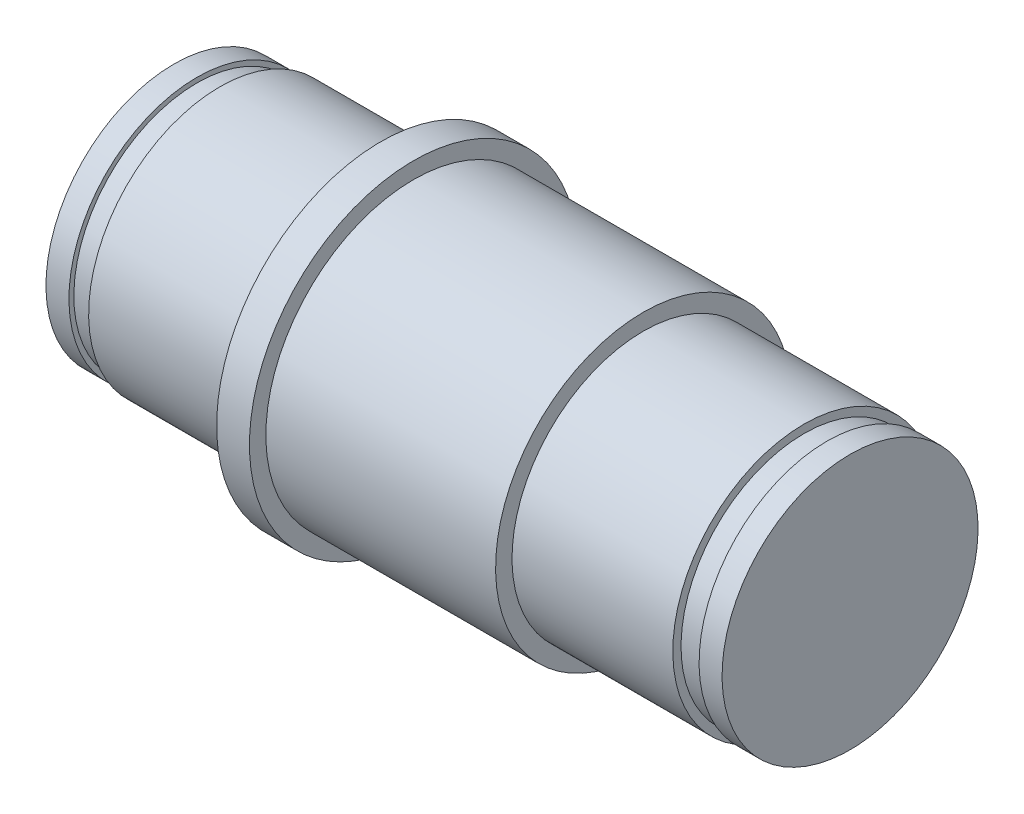
ISO-10303-21;
HEADER;
FILE_DESCRIPTION(('STEP AP214'),'2;1');
FILE_NAME('part.step','',(''),(''),'','','');
FILE_SCHEMA(('AUTOMOTIVE_DESIGN { 1 0 10303 214 1 1 1 1 }'));
ENDSEC;
DATA;
#1=APPLICATION_CONTEXT('core data for automotive mechanical design processes');
#2=APPLICATION_PROTOCOL_DEFINITION('international standard','automotive_design',2000,#1);
#3=PRODUCT_CONTEXT('',#1,'mechanical');
#4=PRODUCT('Part','Part','',(#3));
#5=PRODUCT_RELATED_PRODUCT_CATEGORY('part','',(#4));
#6=PRODUCT_DEFINITION_FORMATION('','',#4);
#7=PRODUCT_DEFINITION_CONTEXT('part definition',#1,'design');
#8=PRODUCT_DEFINITION('design','',#6,#7);
#9=PRODUCT_DEFINITION_SHAPE('','',#8);
#10=(LENGTH_UNIT() NAMED_UNIT(*) SI_UNIT(.MILLI.,.METRE.));
#11=(NAMED_UNIT(*) PLANE_ANGLE_UNIT() SI_UNIT($,.RADIAN.));
#12=(NAMED_UNIT(*) SI_UNIT($,.STERADIAN.) SOLID_ANGLE_UNIT());
#13=UNCERTAINTY_MEASURE_WITH_UNIT(LENGTH_MEASURE(1.E-05),#10,'distance_accuracy_value','');
#14=(GEOMETRIC_REPRESENTATION_CONTEXT(3) GLOBAL_UNCERTAINTY_ASSIGNED_CONTEXT((#13)) GLOBAL_UNIT_ASSIGNED_CONTEXT((#10,
#11,#12)) REPRESENTATION_CONTEXT('',''));
#15=CARTESIAN_POINT('',(0.,0.,0.));
#16=DIRECTION('',(0.,0.,1.));
#17=DIRECTION('',(1.,0.,0.));
#18=AXIS2_PLACEMENT_3D('',#15,#16,#17);
#19=CARTESIAN_POINT('',(10.3,3.90000000000001,0.));
#20=DIRECTION('',(1.,0.,0.));
#21=DIRECTION('',(0.,1.,0.));
#22=AXIS2_PLACEMENT_3D('',#19,#20,#21);
#23=PLANE('',#22);
#24=CARTESIAN_POINT('',(10.3,0.,0.));
#25=DIRECTION('',(1.,0.,0.));
#26=DIRECTION('',(0.,1.,0.));
#27=AXIS2_PLACEMENT_3D('',#24,#25,#26);
#28=CIRCLE('',#27,3.90000000000001);
#29=CARTESIAN_POINT('',(10.3,3.90000000000001,0.));
#30=VERTEX_POINT('',#29);
#31=EDGE_CURVE('E83',#30,#30,#28,.T.);
#32=ORIENTED_EDGE('',*,*,#31,.T.);
#33=EDGE_LOOP('',(#32));
#34=FACE_BOUND('',#33,.T.);
#35=ADVANCED_FACE('F37',(#34),#23,.T.);
#36=CARTESIAN_POINT('',(15.6918050758463,0.,0.));
#37=DIRECTION('',(1.,0.,0.));
#38=DIRECTION('',(0.,1.,0.));
#39=AXIS2_PLACEMENT_3D('',#36,#37,#38);
#40=CYLINDRICAL_SURFACE('',#39,4.50000000000042);
#41=CARTESIAN_POINT('',(-3.,0.,0.));
#42=DIRECTION('',(1.,0.,0.));
#43=DIRECTION('',(0.,0.,-1.));
#44=AXIS2_PLACEMENT_3D('',#41,#42,#43);
#45=CIRCLE('',#44,4.50000000000042);
#46=CARTESIAN_POINT('',(-3.,0.,-4.50000000000042));
#47=VERTEX_POINT('',#46);
#48=EDGE_CURVE('E10',#47,#47,#45,.F.);
#49=ORIENTED_EDGE('',*,*,#48,.F.);
#50=EDGE_LOOP('',(#49));
#51=FACE_BOUND('',#50,.T.);
#52=CARTESIAN_POINT('',(4.,0.,0.));
#53=DIRECTION('',(1.,0.,0.));
#54=DIRECTION('',(0.,1.,0.));
#55=AXIS2_PLACEMENT_3D('',#52,#53,#54);
#56=CIRCLE('',#55,4.50000000000042);
#57=CARTESIAN_POINT('',(4.,4.50000000000042,0.));
#58=VERTEX_POINT('',#57);
#59=EDGE_CURVE('E65',#58,#58,#56,.T.);
#60=ORIENTED_EDGE('',*,*,#59,.F.);
#61=EDGE_LOOP('',(#60));
#62=FACE_BOUND('',#61,.T.);
#63=ADVANCED_FACE('F110',(#51,#62),#40,.T.);
#64=CARTESIAN_POINT('',(4.,4.50000000000042,0.));
#65=DIRECTION('',(1.,0.,0.));
#66=DIRECTION('',(0.,1.,0.));
#67=AXIS2_PLACEMENT_3D('',#64,#65,#66);
#68=PLANE('',#67);
#69=ORIENTED_EDGE('',*,*,#59,.T.);
#70=EDGE_LOOP('',(#69));
#71=FACE_BOUND('',#70,.T.);
#72=CARTESIAN_POINT('',(4.,0.,0.));
#73=DIRECTION('',(1.,0.,0.));
#74=DIRECTION('',(0.,1.,0.));
#75=AXIS2_PLACEMENT_3D('',#72,#73,#74);
#76=CIRCLE('',#75,4.);
#77=CARTESIAN_POINT('',(4.,4.,0.));
#78=VERTEX_POINT('',#77);
#79=EDGE_CURVE('E68',#78,#78,#76,.T.);
#80=ORIENTED_EDGE('',*,*,#79,.F.);
#81=EDGE_LOOP('',(#80));
#82=FACE_BOUND('',#81,.T.);
#83=ADVANCED_FACE('F115',(#71,#82),#68,.T.);
#84=CARTESIAN_POINT('',(15.6918050758463,0.,0.));
#85=DIRECTION('',(1.,0.,0.));
#86=DIRECTION('',(0.,1.,0.));
#87=AXIS2_PLACEMENT_3D('',#84,#85,#86);
#88=CYLINDRICAL_SURFACE('',#87,4.);
#89=ORIENTED_EDGE('',*,*,#79,.T.);
#90=EDGE_LOOP('',(#89));
#91=FACE_BOUND('',#90,.T.);
#92=CARTESIAN_POINT('',(8.89999999999999,0.,0.));
#93=DIRECTION('',(1.,0.,0.));
#94=DIRECTION('',(0.,1.,0.));
#95=AXIS2_PLACEMENT_3D('',#92,#93,#94);
#96=CIRCLE('',#95,4.);
#97=CARTESIAN_POINT('',(8.89999999999999,4.,0.));
#98=VERTEX_POINT('',#97);
#99=EDGE_CURVE('E71',#98,#98,#96,.T.);
#100=ORIENTED_EDGE('',*,*,#99,.F.);
#101=EDGE_LOOP('',(#100));
#102=FACE_BOUND('',#101,.T.);
#103=ADVANCED_FACE('F123',(#91,#102),#88,.T.);
#104=CARTESIAN_POINT('',(8.89999999999999,4.,0.));
#105=DIRECTION('',(1.,0.,0.));
#106=DIRECTION('',(0.,1.,0.));
#107=AXIS2_PLACEMENT_3D('',#104,#105,#106);
#108=PLANE('',#107);
#109=ORIENTED_EDGE('',*,*,#99,.T.);
#110=EDGE_LOOP('',(#109));
#111=FACE_BOUND('',#110,.T.);
#112=CARTESIAN_POINT('',(8.89999999999999,0.,0.));
#113=DIRECTION('',(1.,0.,0.));
#114=DIRECTION('',(0.,1.,0.));
#115=AXIS2_PLACEMENT_3D('',#112,#113,#114);
#116=CIRCLE('',#115,3.75);
#117=CARTESIAN_POINT('',(8.89999999999999,3.75,0.));
#118=VERTEX_POINT('',#117);
#119=EDGE_CURVE('E74',#118,#118,#116,.T.);
#120=ORIENTED_EDGE('',*,*,#119,.F.);
#121=EDGE_LOOP('',(#120));
#122=FACE_BOUND('',#121,.T.);
#123=ADVANCED_FACE('F226',(#111,#122),#108,.T.);
#124=CARTESIAN_POINT('',(15.6918050758463,0.,0.));
#125=DIRECTION('',(1.,0.,0.));
#126=DIRECTION('',(0.,1.,0.));
#127=AXIS2_PLACEMENT_3D('',#124,#125,#126);
#128=CYLINDRICAL_SURFACE('',#127,3.75);
#129=ORIENTED_EDGE('',*,*,#119,.T.);
#130=EDGE_LOOP('',(#129));
#131=FACE_BOUND('',#130,.T.);
#132=CARTESIAN_POINT('',(9.6,0.,0.));
#133=DIRECTION('',(1.,0.,0.));
#134=DIRECTION('',(0.,1.,0.));
#135=AXIS2_PLACEMENT_3D('',#132,#133,#134);
#136=CIRCLE('',#135,3.75);
#137=CARTESIAN_POINT('',(9.6,3.75,0.));
#138=VERTEX_POINT('',#137);
#139=EDGE_CURVE('E77',#138,#138,#136,.T.);
#140=ORIENTED_EDGE('',*,*,#139,.F.);
#141=EDGE_LOOP('',(#140));
#142=FACE_BOUND('',#141,.T.);
#143=ADVANCED_FACE('F215',(#131,#142),#128,.T.);
#144=CARTESIAN_POINT('',(9.6,3.75,0.));
#145=DIRECTION('',(-1.,0.,0.));
#146=DIRECTION('',(0.,-1.,0.));
#147=AXIS2_PLACEMENT_3D('',#144,#145,#146);
#148=PLANE('',#147);
#149=ORIENTED_EDGE('',*,*,#139,.T.);
#150=EDGE_LOOP('',(#149));
#151=FACE_BOUND('',#150,.T.);
#152=CARTESIAN_POINT('',(9.6,0.,0.));
#153=DIRECTION('',(1.,0.,0.));
#154=DIRECTION('',(0.,1.,0.));
#155=AXIS2_PLACEMENT_3D('',#152,#153,#154);
#156=CIRCLE('',#155,3.90000000000001);
#157=CARTESIAN_POINT('',(9.6,3.90000000000001,0.));
#158=VERTEX_POINT('',#157);
#159=EDGE_CURVE('E80',#158,#158,#156,.T.);
#160=ORIENTED_EDGE('',*,*,#159,.F.);
#161=EDGE_LOOP('',(#160));
#162=FACE_BOUND('',#161,.T.);
#163=ADVANCED_FACE('F106',(#151,#162),#148,.T.);
#164=CARTESIAN_POINT('',(15.6918050758463,0.,0.));
#165=DIRECTION('',(1.,0.,0.));
#166=DIRECTION('',(0.,1.,0.));
#167=AXIS2_PLACEMENT_3D('',#164,#165,#166);
#168=CYLINDRICAL_SURFACE('',#167,3.90000000000001);
#169=ORIENTED_EDGE('',*,*,#159,.T.);
#170=EDGE_LOOP('',(#169));
#171=FACE_BOUND('',#170,.T.);
#172=ORIENTED_EDGE('',*,*,#31,.F.);
#173=EDGE_LOOP('',(#172));
#174=FACE_BOUND('',#173,.T.);
#175=ADVANCED_FACE('F97',(#171,#174),#168,.T.);
#176=CARTESIAN_POINT('',(0.,0.,0.));
#177=DIRECTION('',(1.,0.,0.));
#178=DIRECTION('',(0.,0.,-1.));
#179=AXIS2_PLACEMENT_3D('',#176,#177,#178);
#180=CYLINDRICAL_SURFACE('',#179,5.00000000000042);
#181=CARTESIAN_POINT('',(-4.,0.,0.));
#182=DIRECTION('',(1.,0.,0.));
#183=DIRECTION('',(0.,0.,-1.));
#184=AXIS2_PLACEMENT_3D('',#181,#182,#183);
#185=CIRCLE('',#184,5.00000000000042);
#186=CARTESIAN_POINT('',(-4.,0.,-5.00000000000042));
#187=VERTEX_POINT('',#186);
#188=EDGE_CURVE('E86',#187,#187,#185,.T.);
#189=ORIENTED_EDGE('',*,*,#188,.T.);
#190=EDGE_LOOP('',(#189));
#191=FACE_BOUND('',#190,.T.);
#192=CARTESIAN_POINT('',(-3.,0.,0.));
#193=DIRECTION('',(1.,0.,0.));
#194=DIRECTION('',(0.,0.,-1.));
#195=AXIS2_PLACEMENT_3D('',#192,#193,#194);
#196=CIRCLE('',#195,5.00000000000042);
#197=CARTESIAN_POINT('',(-3.,0.,-5.00000000000042));
#198=VERTEX_POINT('',#197);
#199=EDGE_CURVE('E89',#198,#198,#196,.T.);
#200=ORIENTED_EDGE('',*,*,#199,.F.);
#201=EDGE_LOOP('',(#200));
#202=FACE_BOUND('',#201,.T.);
#203=ADVANCED_FACE('F95',(#191,#202),#180,.T.);
#204=CARTESIAN_POINT('',(-3.,4.50000000000042,0.));
#205=DIRECTION('',(1.,0.,0.));
#206=DIRECTION('',(0.,0.,-1.));
#207=AXIS2_PLACEMENT_3D('',#204,#205,#206);
#208=PLANE('',#207);
#209=ORIENTED_EDGE('',*,*,#199,.T.);
#210=EDGE_LOOP('',(#209));
#211=FACE_BOUND('',#210,.T.);
#212=ORIENTED_EDGE('',*,*,#48,.T.);
#213=EDGE_LOOP('',(#212));
#214=FACE_BOUND('',#213,.T.);
#215=ADVANCED_FACE('F93',(#211,#214),#208,.T.);
#216=CARTESIAN_POINT('',(-10.3,0.,0.));
#217=DIRECTION('',(-1.,0.,0.));
#218=DIRECTION('',(0.,-1.,0.));
#219=AXIS2_PLACEMENT_3D('',#216,#217,#218);
#220=PLANE('',#219);
#221=CARTESIAN_POINT('',(-10.3,0.,0.));
#222=DIRECTION('',(1.,0.,0.));
#223=DIRECTION('',(0.,1.,0.));
#224=AXIS2_PLACEMENT_3D('',#221,#222,#223);
#225=CIRCLE('',#224,3.89999999999999);
#226=CARTESIAN_POINT('',(-10.3,3.89999999999999,0.));
#227=VERTEX_POINT('',#226);
#228=EDGE_CURVE('E43',#227,#227,#225,.T.);
#229=ORIENTED_EDGE('',*,*,#228,.F.);
#230=EDGE_LOOP('',(#229));
#231=FACE_BOUND('',#230,.T.);
#232=ADVANCED_FACE('F104',(#231),#220,.T.);
#233=CARTESIAN_POINT('',(15.6918050758463,0.,0.));
#234=DIRECTION('',(1.,0.,0.));
#235=DIRECTION('',(0.,1.,0.));
#236=AXIS2_PLACEMENT_3D('',#233,#234,#235);
#237=CYLINDRICAL_SURFACE('',#236,3.89999999999999);
#238=ORIENTED_EDGE('',*,*,#228,.T.);
#239=EDGE_LOOP('',(#238));
#240=FACE_BOUND('',#239,.T.);
#241=CARTESIAN_POINT('',(-9.6,0.,0.));
#242=DIRECTION('',(1.,0.,0.));
#243=DIRECTION('',(0.,1.,0.));
#244=AXIS2_PLACEMENT_3D('',#241,#242,#243);
#245=CIRCLE('',#244,3.89999999999999);
#246=CARTESIAN_POINT('',(-9.6,3.89999999999999,0.));
#247=VERTEX_POINT('',#246);
#248=EDGE_CURVE('E47',#247,#247,#245,.T.);
#249=ORIENTED_EDGE('',*,*,#248,.F.);
#250=EDGE_LOOP('',(#249));
#251=FACE_BOUND('',#250,.T.);
#252=ADVANCED_FACE('F148',(#240,#251),#237,.T.);
#253=CARTESIAN_POINT('',(-9.6,3.89999999999999,0.));
#254=DIRECTION('',(1.,0.,0.));
#255=DIRECTION('',(0.,1.,0.));
#256=AXIS2_PLACEMENT_3D('',#253,#254,#255);
#257=PLANE('',#256);
#258=ORIENTED_EDGE('',*,*,#248,.T.);
#259=EDGE_LOOP('',(#258));
#260=FACE_BOUND('',#259,.T.);
#261=CARTESIAN_POINT('',(-9.6,0.,0.));
#262=DIRECTION('',(1.,0.,0.));
#263=DIRECTION('',(0.,1.,0.));
#264=AXIS2_PLACEMENT_3D('',#261,#262,#263);
#265=CIRCLE('',#264,3.75);
#266=CARTESIAN_POINT('',(-9.6,3.75,0.));
#267=VERTEX_POINT('',#266);
#268=EDGE_CURVE('E51',#267,#267,#265,.T.);
#269=ORIENTED_EDGE('',*,*,#268,.F.);
#270=EDGE_LOOP('',(#269));
#271=FACE_BOUND('',#270,.T.);
#272=ADVANCED_FACE('F144',(#260,#271),#257,.T.);
#273=CARTESIAN_POINT('',(15.6918050758463,0.,0.));
#274=DIRECTION('',(1.,0.,0.));
#275=DIRECTION('',(0.,1.,0.));
#276=AXIS2_PLACEMENT_3D('',#273,#274,#275);
#277=CYLINDRICAL_SURFACE('',#276,3.75);
#278=ORIENTED_EDGE('',*,*,#268,.T.);
#279=EDGE_LOOP('',(#278));
#280=FACE_BOUND('',#279,.T.);
#281=CARTESIAN_POINT('',(-8.90000000000001,0.,0.));
#282=DIRECTION('',(1.,0.,0.));
#283=DIRECTION('',(0.,1.,0.));
#284=AXIS2_PLACEMENT_3D('',#281,#282,#283);
#285=CIRCLE('',#284,3.75);
#286=CARTESIAN_POINT('',(-8.90000000000001,3.75,0.));
#287=VERTEX_POINT('',#286);
#288=EDGE_CURVE('E56',#287,#287,#285,.T.);
#289=ORIENTED_EDGE('',*,*,#288,.F.);
#290=EDGE_LOOP('',(#289));
#291=FACE_BOUND('',#290,.T.);
#292=ADVANCED_FACE('F140',(#280,#291),#277,.T.);
#293=CARTESIAN_POINT('',(-8.90000000000001,3.75,0.));
#294=DIRECTION('',(-1.,0.,0.));
#295=DIRECTION('',(0.,-1.,0.));
#296=AXIS2_PLACEMENT_3D('',#293,#294,#295);
#297=PLANE('',#296);
#298=ORIENTED_EDGE('',*,*,#288,.T.);
#299=EDGE_LOOP('',(#298));
#300=FACE_BOUND('',#299,.T.);
#301=CARTESIAN_POINT('',(-8.90000000000001,0.,0.));
#302=DIRECTION('',(1.,0.,0.));
#303=DIRECTION('',(0.,1.,0.));
#304=AXIS2_PLACEMENT_3D('',#301,#302,#303);
#305=CIRCLE('',#304,4.);
#306=CARTESIAN_POINT('',(-8.90000000000001,4.,0.));
#307=VERTEX_POINT('',#306);
#308=EDGE_CURVE('E59',#307,#307,#305,.T.);
#309=ORIENTED_EDGE('',*,*,#308,.F.);
#310=EDGE_LOOP('',(#309));
#311=FACE_BOUND('',#310,.T.);
#312=ADVANCED_FACE('F136',(#300,#311),#297,.T.);
#313=CARTESIAN_POINT('',(15.6918050758463,0.,0.));
#314=DIRECTION('',(1.,0.,0.));
#315=DIRECTION('',(0.,1.,0.));
#316=AXIS2_PLACEMENT_3D('',#313,#314,#315);
#317=CYLINDRICAL_SURFACE('',#316,4.);
#318=ORIENTED_EDGE('',*,*,#308,.T.);
#319=EDGE_LOOP('',(#318));
#320=FACE_BOUND('',#319,.T.);
#321=CARTESIAN_POINT('',(-4.,0.,0.));
#322=DIRECTION('',(1.,0.,0.));
#323=DIRECTION('',(0.,1.,0.));
#324=AXIS2_PLACEMENT_3D('',#321,#322,#323);
#325=CIRCLE('',#324,4.);
#326=CARTESIAN_POINT('',(-4.,4.,0.));
#327=VERTEX_POINT('',#326);
#328=EDGE_CURVE('E62',#327,#327,#325,.T.);
#329=ORIENTED_EDGE('',*,*,#328,.F.);
#330=EDGE_LOOP('',(#329));
#331=FACE_BOUND('',#330,.T.);
#332=ADVANCED_FACE('F132',(#320,#331),#317,.T.);
#333=CARTESIAN_POINT('',(-4.,4.,0.));
#334=DIRECTION('',(-1.,0.,0.));
#335=DIRECTION('',(0.,-1.,0.));
#336=AXIS2_PLACEMENT_3D('',#333,#334,#335);
#337=PLANE('',#336);
#338=ORIENTED_EDGE('',*,*,#328,.T.);
#339=EDGE_LOOP('',(#338));
#340=FACE_BOUND('',#339,.T.);
#341=ORIENTED_EDGE('',*,*,#188,.F.);
#342=EDGE_LOOP('',(#341));
#343=FACE_BOUND('',#342,.T.);
#344=ADVANCED_FACE('F129',(#340,#343),#337,.T.);
#345=CLOSED_SHELL('',(#35,#63,#83,#103,#123,#143,#163,#175,#203,#215,#232,#252,#272,#292,#312,
#332,#344));
#346=MANIFOLD_SOLID_BREP('B2',#345);
#347=ADVANCED_BREP_SHAPE_REPRESENTATION('',(#18,#346),#14);
#348=SHAPE_DEFINITION_REPRESENTATION(#9,#347);
ENDSEC;
END-ISO-10303-21;
